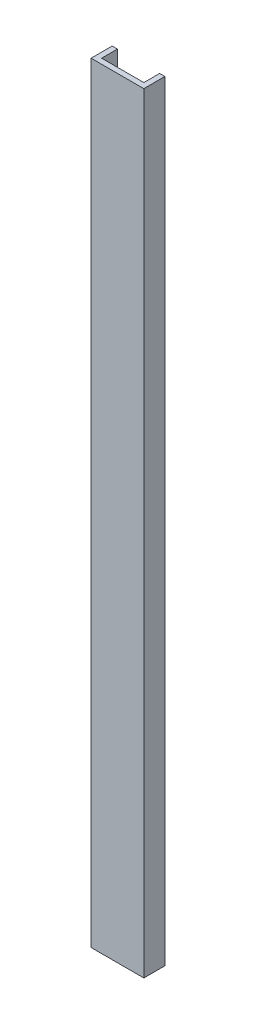
ISO-10303-21;
HEADER;
FILE_DESCRIPTION(('STEP AP214'),'2;1');
FILE_NAME('part.step','',(''),(''),'','','');
FILE_SCHEMA(('AUTOMOTIVE_DESIGN { 1 0 10303 214 1 1 1 1 }'));
ENDSEC;
DATA;
#1=APPLICATION_CONTEXT('core data for automotive mechanical design processes');
#2=APPLICATION_PROTOCOL_DEFINITION('international standard','automotive_design',2000,#1);
#3=PRODUCT_CONTEXT('',#1,'mechanical');
#4=PRODUCT('Part','Part','',(#3));
#5=PRODUCT_RELATED_PRODUCT_CATEGORY('part','',(#4));
#6=PRODUCT_DEFINITION_FORMATION('','',#4);
#7=PRODUCT_DEFINITION_CONTEXT('part definition',#1,'design');
#8=PRODUCT_DEFINITION('design','',#6,#7);
#9=PRODUCT_DEFINITION_SHAPE('','',#8);
#10=(LENGTH_UNIT() NAMED_UNIT(*) SI_UNIT(.MILLI.,.METRE.));
#11=(NAMED_UNIT(*) PLANE_ANGLE_UNIT() SI_UNIT($,.RADIAN.));
#12=(NAMED_UNIT(*) SI_UNIT($,.STERADIAN.) SOLID_ANGLE_UNIT());
#13=UNCERTAINTY_MEASURE_WITH_UNIT(LENGTH_MEASURE(1.E-05),#10,'distance_accuracy_value','');
#14=(GEOMETRIC_REPRESENTATION_CONTEXT(3) GLOBAL_UNCERTAINTY_ASSIGNED_CONTEXT((#13)) GLOBAL_UNIT_ASSIGNED_CONTEXT((#10,
#11,#12)) REPRESENTATION_CONTEXT('',''));
#15=CARTESIAN_POINT('',(0.,0.,0.));
#16=DIRECTION('',(0.,0.,1.));
#17=DIRECTION('',(1.,0.,0.));
#18=AXIS2_PLACEMENT_3D('',#15,#16,#17);
#19=CARTESIAN_POINT('',(0.,463.6135,0.));
#20=DIRECTION('',(1.,0.,0.));
#21=DIRECTION('',(0.,0.,-1.));
#22=AXIS2_PLACEMENT_3D('',#19,#20,#21);
#23=PLANE('',#22);
#24=DIRECTION('',(0.,0.,1.));
#25=VECTOR('',#24,1.);
#26=CARTESIAN_POINT('',(0.,0.,0.));
#27=LINE('',#26,#25);
#28=CARTESIAN_POINT('',(0.,0.,-12.7));
#29=VERTEX_POINT('',#28);
#30=CARTESIAN_POINT('',(0.,0.,0.));
#31=VERTEX_POINT('',#30);
#32=EDGE_CURVE('E129',#29,#31,#27,.T.);
#33=ORIENTED_EDGE('',*,*,#32,.T.);
#34=DIRECTION('',(0.,-1.,0.));
#35=VECTOR('',#34,1.);
#36=CARTESIAN_POINT('',(0.,463.6135,0.));
#37=LINE('',#36,#35);
#38=CARTESIAN_POINT('',(0.,463.6135,0.));
#39=VERTEX_POINT('',#38);
#40=EDGE_CURVE('E11',#39,#31,#37,.T.);
#41=ORIENTED_EDGE('',*,*,#40,.F.);
#42=DIRECTION('',(0.,0.,1.));
#43=VECTOR('',#42,1.);
#44=CARTESIAN_POINT('',(0.,463.6135,0.));
#45=LINE('',#44,#43);
#46=CARTESIAN_POINT('',(0.,463.6135,-12.7));
#47=VERTEX_POINT('',#46);
#48=EDGE_CURVE('E143',#47,#39,#45,.T.);
#49=ORIENTED_EDGE('',*,*,#48,.F.);
#50=DIRECTION('',(0.,-1.,0.));
#51=VECTOR('',#50,1.);
#52=CARTESIAN_POINT('',(0.,463.6135,-12.7));
#53=LINE('',#52,#51);
#54=EDGE_CURVE('E125',#47,#29,#53,.T.);
#55=ORIENTED_EDGE('',*,*,#54,.T.);
#56=EDGE_LOOP('',(#33,#41,#49,#55));
#57=FACE_BOUND('',#56,.T.);
#58=ADVANCED_FACE('F33',(#57),#23,.F.);
#59=CARTESIAN_POINT('',(0.,463.6135,0.));
#60=DIRECTION('',(0.,0.,-1.));
#61=DIRECTION('',(-1.,0.,0.));
#62=AXIS2_PLACEMENT_3D('',#59,#60,#61);
#63=PLANE('',#62);
#64=DIRECTION('',(1.,0.,0.));
#65=VECTOR('',#64,1.);
#66=CARTESIAN_POINT('',(0.,0.,0.));
#67=LINE('',#66,#65);
#68=CARTESIAN_POINT('',(31.75,0.,0.));
#69=VERTEX_POINT('',#68);
#70=EDGE_CURVE('E132',#31,#69,#67,.T.);
#71=ORIENTED_EDGE('',*,*,#70,.T.);
#72=DIRECTION('',(0.,-1.,0.));
#73=VECTOR('',#72,1.);
#74=CARTESIAN_POINT('',(31.75,463.6135,0.));
#75=LINE('',#74,#73);
#76=CARTESIAN_POINT('',(31.75,463.6135,0.));
#77=VERTEX_POINT('',#76);
#78=EDGE_CURVE('E41',#77,#69,#75,.T.);
#79=ORIENTED_EDGE('',*,*,#78,.F.);
#80=DIRECTION('',(1.,0.,0.));
#81=VECTOR('',#80,1.);
#82=CARTESIAN_POINT('',(0.,463.6135,0.));
#83=LINE('',#82,#81);
#84=EDGE_CURVE('E92',#39,#77,#83,.T.);
#85=ORIENTED_EDGE('',*,*,#84,.F.);
#86=ORIENTED_EDGE('',*,*,#40,.T.);
#87=EDGE_LOOP('',(#71,#79,#85,#86));
#88=FACE_BOUND('',#87,.T.);
#89=ADVANCED_FACE('F178',(#88),#63,.F.);
#90=CARTESIAN_POINT('',(31.75,463.6135,0.));
#91=DIRECTION('',(-1.,0.,0.));
#92=DIRECTION('',(0.,0.,1.));
#93=AXIS2_PLACEMENT_3D('',#90,#91,#92);
#94=PLANE('',#93);
#95=DIRECTION('',(0.,0.,-1.));
#96=VECTOR('',#95,1.);
#97=CARTESIAN_POINT('',(31.75,0.,0.));
#98=LINE('',#97,#96);
#99=CARTESIAN_POINT('',(31.75,0.,-12.7));
#100=VERTEX_POINT('',#99);
#101=EDGE_CURVE('E134',#69,#100,#98,.T.);
#102=ORIENTED_EDGE('',*,*,#101,.T.);
#103=DIRECTION('',(0.,-1.,0.));
#104=VECTOR('',#103,1.);
#105=CARTESIAN_POINT('',(31.75,463.6135,-12.7));
#106=LINE('',#105,#104);
#107=CARTESIAN_POINT('',(31.75,463.6135,-12.7));
#108=VERTEX_POINT('',#107);
#109=EDGE_CURVE('E150',#108,#100,#106,.T.);
#110=ORIENTED_EDGE('',*,*,#109,.F.);
#111=DIRECTION('',(0.,0.,-1.));
#112=VECTOR('',#111,1.);
#113=CARTESIAN_POINT('',(31.75,463.6135,0.));
#114=LINE('',#113,#112);
#115=EDGE_CURVE('E158',#77,#108,#114,.T.);
#116=ORIENTED_EDGE('',*,*,#115,.F.);
#117=ORIENTED_EDGE('',*,*,#78,.T.);
#118=EDGE_LOOP('',(#102,#110,#116,#117));
#119=FACE_BOUND('',#118,.T.);
#120=ADVANCED_FACE('F156',(#119),#94,.F.);
#121=CARTESIAN_POINT('',(31.75,463.6135,-12.7));
#122=DIRECTION('',(0.,0.,1.));
#123=DIRECTION('',(1.,0.,0.));
#124=AXIS2_PLACEMENT_3D('',#121,#122,#123);
#125=PLANE('',#124);
#126=DIRECTION('',(-1.,0.,0.));
#127=VECTOR('',#126,1.);
#128=CARTESIAN_POINT('',(31.75,0.,-12.7));
#129=LINE('',#128,#127);
#130=CARTESIAN_POINT('',(28.575,0.,-12.7));
#131=VERTEX_POINT('',#130);
#132=EDGE_CURVE('E136',#100,#131,#129,.T.);
#133=ORIENTED_EDGE('',*,*,#132,.T.);
#134=DIRECTION('',(0.,-1.,0.));
#135=VECTOR('',#134,1.);
#136=CARTESIAN_POINT('',(28.575,463.6135,-12.7));
#137=LINE('',#136,#135);
#138=CARTESIAN_POINT('',(28.575,463.6135,-12.7));
#139=VERTEX_POINT('',#138);
#140=EDGE_CURVE('E147',#139,#131,#137,.T.);
#141=ORIENTED_EDGE('',*,*,#140,.F.);
#142=DIRECTION('',(-1.,0.,0.));
#143=VECTOR('',#142,1.);
#144=CARTESIAN_POINT('',(31.75,463.6135,-12.7));
#145=LINE('',#144,#143);
#146=EDGE_CURVE('E170',#108,#139,#145,.T.);
#147=ORIENTED_EDGE('',*,*,#146,.F.);
#148=ORIENTED_EDGE('',*,*,#109,.T.);
#149=EDGE_LOOP('',(#133,#141,#147,#148));
#150=FACE_BOUND('',#149,.T.);
#151=ADVANCED_FACE('F166',(#150),#125,.F.);
#152=CARTESIAN_POINT('',(28.575,463.6135,-3.175));
#153=DIRECTION('',(1.,0.,0.));
#154=DIRECTION('',(0.,0.,-1.));
#155=AXIS2_PLACEMENT_3D('',#152,#153,#154);
#156=PLANE('',#155);
#157=DIRECTION('',(0.,0.,1.));
#158=VECTOR('',#157,1.);
#159=CARTESIAN_POINT('',(28.575,0.,-3.175));
#160=LINE('',#159,#158);
#161=CARTESIAN_POINT('',(28.575,0.,-3.175));
#162=VERTEX_POINT('',#161);
#163=EDGE_CURVE('E138',#131,#162,#160,.T.);
#164=ORIENTED_EDGE('',*,*,#163,.T.);
#165=DIRECTION('',(0.,-1.,0.));
#166=VECTOR('',#165,1.);
#167=CARTESIAN_POINT('',(28.575,463.6135,-3.175));
#168=LINE('',#167,#166);
#169=CARTESIAN_POINT('',(28.575,463.6135,-3.175));
#170=VERTEX_POINT('',#169);
#171=EDGE_CURVE('E120',#170,#162,#168,.T.);
#172=ORIENTED_EDGE('',*,*,#171,.F.);
#173=DIRECTION('',(0.,0.,1.));
#174=VECTOR('',#173,1.);
#175=CARTESIAN_POINT('',(28.575,463.6135,-3.175));
#176=LINE('',#175,#174);
#177=EDGE_CURVE('E111',#139,#170,#176,.T.);
#178=ORIENTED_EDGE('',*,*,#177,.F.);
#179=ORIENTED_EDGE('',*,*,#140,.T.);
#180=EDGE_LOOP('',(#164,#172,#178,#179));
#181=FACE_BOUND('',#180,.T.);
#182=ADVANCED_FACE('F169',(#181),#156,.F.);
#183=CARTESIAN_POINT('',(3.175,463.6135,-3.175));
#184=DIRECTION('',(0.,0.,1.));
#185=DIRECTION('',(1.,0.,0.));
#186=AXIS2_PLACEMENT_3D('',#183,#184,#185);
#187=PLANE('',#186);
#188=DIRECTION('',(-1.,0.,0.));
#189=VECTOR('',#188,1.);
#190=CARTESIAN_POINT('',(3.175,0.,-3.175));
#191=LINE('',#190,#189);
#192=CARTESIAN_POINT('',(3.175,0.,-3.175));
#193=VERTEX_POINT('',#192);
#194=EDGE_CURVE('E119',#162,#193,#191,.T.);
#195=ORIENTED_EDGE('',*,*,#194,.T.);
#196=DIRECTION('',(0.,-1.,0.));
#197=VECTOR('',#196,1.);
#198=CARTESIAN_POINT('',(3.175,463.6135,-3.175));
#199=LINE('',#198,#197);
#200=CARTESIAN_POINT('',(3.175,463.6135,-3.175));
#201=VERTEX_POINT('',#200);
#202=EDGE_CURVE('E116',#201,#193,#199,.T.);
#203=ORIENTED_EDGE('',*,*,#202,.F.);
#204=DIRECTION('',(-1.,0.,0.));
#205=VECTOR('',#204,1.);
#206=CARTESIAN_POINT('',(3.175,463.6135,-3.175));
#207=LINE('',#206,#205);
#208=EDGE_CURVE('E105',#170,#201,#207,.T.);
#209=ORIENTED_EDGE('',*,*,#208,.F.);
#210=ORIENTED_EDGE('',*,*,#171,.T.);
#211=EDGE_LOOP('',(#195,#203,#209,#210));
#212=FACE_BOUND('',#211,.T.);
#213=ADVANCED_FACE('F117',(#212),#187,.F.);
#214=CARTESIAN_POINT('',(3.175,463.6135,-3.175));
#215=DIRECTION('',(-1.,0.,0.));
#216=DIRECTION('',(0.,0.,1.));
#217=AXIS2_PLACEMENT_3D('',#214,#215,#216);
#218=PLANE('',#217);
#219=DIRECTION('',(0.,0.,-1.));
#220=VECTOR('',#219,1.);
#221=CARTESIAN_POINT('',(3.175,0.,-3.175));
#222=LINE('',#221,#220);
#223=CARTESIAN_POINT('',(3.175,0.,-12.7));
#224=VERTEX_POINT('',#223);
#225=EDGE_CURVE('E78',#193,#224,#222,.T.);
#226=ORIENTED_EDGE('',*,*,#225,.T.);
#227=DIRECTION('',(0.,-1.,0.));
#228=VECTOR('',#227,1.);
#229=CARTESIAN_POINT('',(3.175,463.6135,-12.7));
#230=LINE('',#229,#228);
#231=CARTESIAN_POINT('',(3.175,463.6135,-12.7));
#232=VERTEX_POINT('',#231);
#233=EDGE_CURVE('E121',#232,#224,#230,.T.);
#234=ORIENTED_EDGE('',*,*,#233,.F.);
#235=DIRECTION('',(0.,0.,-1.));
#236=VECTOR('',#235,1.);
#237=CARTESIAN_POINT('',(3.175,463.6135,-3.175));
#238=LINE('',#237,#236);
#239=EDGE_CURVE('E109',#201,#232,#238,.T.);
#240=ORIENTED_EDGE('',*,*,#239,.F.);
#241=ORIENTED_EDGE('',*,*,#202,.T.);
#242=EDGE_LOOP('',(#226,#234,#240,#241));
#243=FACE_BOUND('',#242,.T.);
#244=ADVANCED_FACE('F123',(#243),#218,.F.);
#245=CARTESIAN_POINT('',(0.,463.6135,-12.7));
#246=DIRECTION('',(0.,0.,1.));
#247=DIRECTION('',(1.,0.,0.));
#248=AXIS2_PLACEMENT_3D('',#245,#246,#247);
#249=PLANE('',#248);
#250=DIRECTION('',(-1.,0.,0.));
#251=VECTOR('',#250,1.);
#252=CARTESIAN_POINT('',(0.,0.,-12.7));
#253=LINE('',#252,#251);
#254=EDGE_CURVE('E84',#224,#29,#253,.T.);
#255=ORIENTED_EDGE('',*,*,#254,.T.);
#256=ORIENTED_EDGE('',*,*,#54,.F.);
#257=DIRECTION('',(-1.,0.,0.));
#258=VECTOR('',#257,1.);
#259=CARTESIAN_POINT('',(0.,463.6135,-12.7));
#260=LINE('',#259,#258);
#261=EDGE_CURVE('E49',#232,#47,#260,.T.);
#262=ORIENTED_EDGE('',*,*,#261,.F.);
#263=ORIENTED_EDGE('',*,*,#233,.T.);
#264=EDGE_LOOP('',(#255,#256,#262,#263));
#265=FACE_BOUND('',#264,.T.);
#266=ADVANCED_FACE('F194',(#265),#249,.F.);
#267=CARTESIAN_POINT('',(0.,463.6135,0.));
#268=DIRECTION('',(0.,-1.,0.));
#269=DIRECTION('',(0.,0.,-1.));
#270=AXIS2_PLACEMENT_3D('',#267,#268,#269);
#271=PLANE('',#270);
#272=ORIENTED_EDGE('',*,*,#48,.T.);
#273=ORIENTED_EDGE('',*,*,#84,.T.);
#274=ORIENTED_EDGE('',*,*,#115,.T.);
#275=ORIENTED_EDGE('',*,*,#146,.T.);
#276=ORIENTED_EDGE('',*,*,#177,.T.);
#277=ORIENTED_EDGE('',*,*,#208,.T.);
#278=ORIENTED_EDGE('',*,*,#239,.T.);
#279=ORIENTED_EDGE('',*,*,#261,.T.);
#280=EDGE_LOOP('',(#272,#273,#274,#275,#276,#277,#278,#279));
#281=FACE_BOUND('',#280,.T.);
#282=ADVANCED_FACE('F107',(#281),#271,.F.);
#283=CARTESIAN_POINT('',(0.,0.,0.));
#284=DIRECTION('',(0.,-1.,0.));
#285=DIRECTION('',(0.,0.,-1.));
#286=AXIS2_PLACEMENT_3D('',#283,#284,#285);
#287=PLANE('',#286);
#288=ORIENTED_EDGE('',*,*,#32,.F.);
#289=ORIENTED_EDGE('',*,*,#254,.F.);
#290=ORIENTED_EDGE('',*,*,#225,.F.);
#291=ORIENTED_EDGE('',*,*,#194,.F.);
#292=ORIENTED_EDGE('',*,*,#163,.F.);
#293=ORIENTED_EDGE('',*,*,#132,.F.);
#294=ORIENTED_EDGE('',*,*,#101,.F.);
#295=ORIENTED_EDGE('',*,*,#70,.F.);
#296=EDGE_LOOP('',(#288,#289,#290,#291,#292,#293,#294,#295));
#297=FACE_BOUND('',#296,.T.);
#298=ADVANCED_FACE('F162',(#297),#287,.T.);
#299=CLOSED_SHELL('',(#58,#89,#120,#151,#182,#213,#244,#266,#282,#298));
#300=MANIFOLD_SOLID_BREP('B2',#299);
#301=ADVANCED_BREP_SHAPE_REPRESENTATION('',(#18,#300),#14);
#302=SHAPE_DEFINITION_REPRESENTATION(#9,#301);
ENDSEC;
END-ISO-10303-21;
